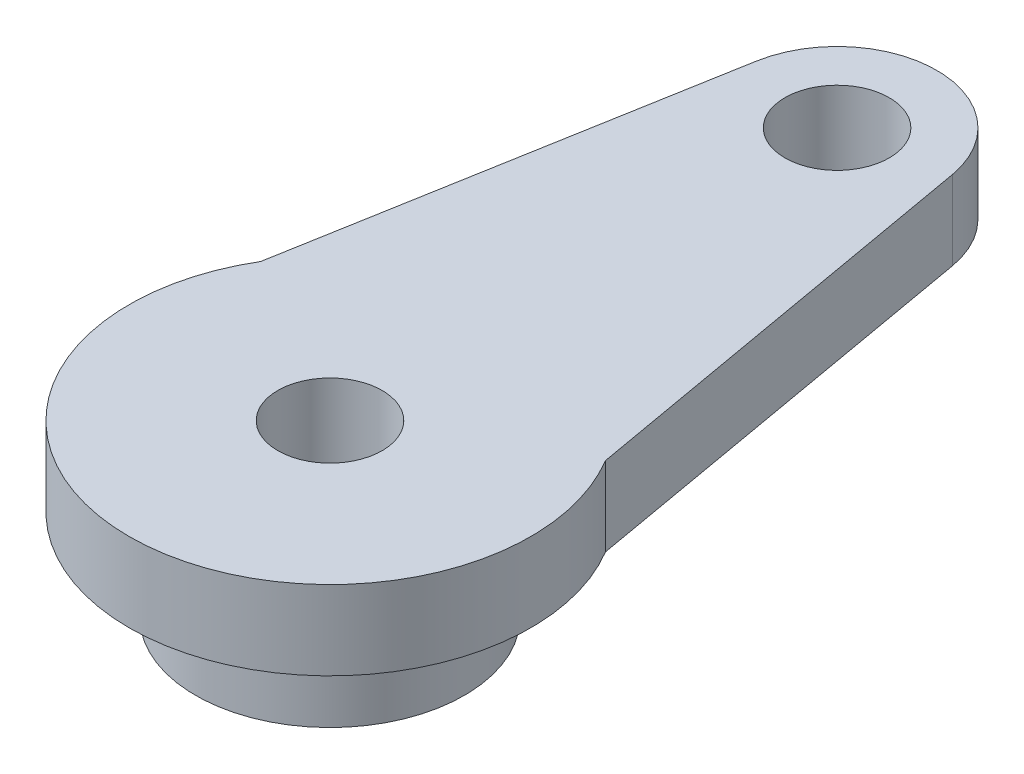
ISO-10303-21;
HEADER;
FILE_DESCRIPTION(('STEP AP214'),'2;1');
FILE_NAME('part.step','',(''),(''),'','','');
FILE_SCHEMA(('AUTOMOTIVE_DESIGN { 1 0 10303 214 1 1 1 1 }'));
ENDSEC;
DATA;
#1=APPLICATION_CONTEXT('core data for automotive mechanical design processes');
#2=APPLICATION_PROTOCOL_DEFINITION('international standard','automotive_design',2000,#1);
#3=PRODUCT_CONTEXT('',#1,'mechanical');
#4=PRODUCT('Part','Part','',(#3));
#5=PRODUCT_RELATED_PRODUCT_CATEGORY('part','',(#4));
#6=PRODUCT_DEFINITION_FORMATION('','',#4);
#7=PRODUCT_DEFINITION_CONTEXT('part definition',#1,'design');
#8=PRODUCT_DEFINITION('design','',#6,#7);
#9=PRODUCT_DEFINITION_SHAPE('','',#8);
#10=(LENGTH_UNIT() NAMED_UNIT(*) SI_UNIT(.MILLI.,.METRE.));
#11=(NAMED_UNIT(*) PLANE_ANGLE_UNIT() SI_UNIT($,.RADIAN.));
#12=(NAMED_UNIT(*) SI_UNIT($,.STERADIAN.) SOLID_ANGLE_UNIT());
#13=UNCERTAINTY_MEASURE_WITH_UNIT(LENGTH_MEASURE(1.E-05),#10,'distance_accuracy_value','');
#14=(GEOMETRIC_REPRESENTATION_CONTEXT(3) GLOBAL_UNCERTAINTY_ASSIGNED_CONTEXT((#13)) GLOBAL_UNIT_ASSIGNED_CONTEXT((#10,
#11,#12)) REPRESENTATION_CONTEXT('',''));
#15=CARTESIAN_POINT('',(0.,0.,0.));
#16=DIRECTION('',(0.,0.,1.));
#17=DIRECTION('',(1.,0.,0.));
#18=AXIS2_PLACEMENT_3D('',#15,#16,#17);
#19=CARTESIAN_POINT('',(0.,0.,0.));
#20=DIRECTION('',(0.,1.,0.));
#21=DIRECTION('',(0.,0.,1.));
#22=AXIS2_PLACEMENT_3D('',#19,#20,#21);
#23=PLANE('',#22);
#24=CARTESIAN_POINT('',(0.,0.,0.));
#25=DIRECTION('',(0.,-1.,0.));
#26=DIRECTION('',(0.,0.,-1.));
#27=AXIS2_PLACEMENT_3D('',#24,#25,#26);
#28=CIRCLE('',#27,3.025);
#29=CARTESIAN_POINT('',(0.,0.,-3.025));
#30=VERTEX_POINT('',#29);
#31=EDGE_CURVE('E174',#30,#30,#28,.T.);
#32=ORIENTED_EDGE('',*,*,#31,.F.);
#33=EDGE_LOOP('',(#32));
#34=FACE_BOUND('',#33,.T.);
#35=CARTESIAN_POINT('',(0.,0.,0.));
#36=DIRECTION('',(0.,-1.,0.));
#37=DIRECTION('',(0.,0.,-1.));
#38=AXIS2_PLACEMENT_3D('',#35,#36,#37);
#39=CIRCLE('',#38,4.25);
#40=CARTESIAN_POINT('',(0.,0.,-4.25));
#41=VERTEX_POINT('',#40);
#42=EDGE_CURVE('E101',#41,#41,#39,.T.);
#43=ORIENTED_EDGE('',*,*,#42,.T.);
#44=EDGE_LOOP('',(#43));
#45=FACE_BOUND('',#44,.T.);
#46=ADVANCED_FACE('F41',(#34,#45),#23,.F.);
#47=CARTESIAN_POINT('',(0.,5.4,0.));
#48=DIRECTION('',(0.,-1.,0.));
#49=DIRECTION('',(0.,0.,-1.));
#50=AXIS2_PLACEMENT_3D('',#47,#48,#49);
#51=CYLINDRICAL_SURFACE('',#50,6.35);
#52=DIRECTION('',(0.,1.,0.));
#53=VECTOR('',#52,1.);
#54=CARTESIAN_POINT('',(-5.45070200344737,2.9,-3.25765984559696));
#55=LINE('',#54,#53);
#56=CARTESIAN_POINT('',(-5.45070200344737,2.9,-3.25765984559696));
#57=VERTEX_POINT('',#56);
#58=CARTESIAN_POINT('',(-5.45070200344738,5.4,-3.25765984559695));
#59=VERTEX_POINT('',#58);
#60=EDGE_CURVE('E97',#57,#59,#55,.T.);
#61=ORIENTED_EDGE('',*,*,#60,.F.);
#62=CARTESIAN_POINT('',(0.,2.9,0.));
#63=DIRECTION('',(0.,1.,0.));
#64=DIRECTION('',(0.,0.,1.));
#65=AXIS2_PLACEMENT_3D('',#62,#63,#64);
#66=CIRCLE('',#65,6.35);
#67=CARTESIAN_POINT('',(5.45070200344738,2.9,-3.25765984559695));
#68=VERTEX_POINT('',#67);
#69=EDGE_CURVE('E93',#68,#57,#66,.F.);
#70=ORIENTED_EDGE('',*,*,#69,.F.);
#71=DIRECTION('',(0.,1.,0.));
#72=VECTOR('',#71,1.);
#73=CARTESIAN_POINT('',(5.45070200344737,2.9,-3.25765984559696));
#74=LINE('',#73,#72);
#75=CARTESIAN_POINT('',(5.45070200344737,5.4,-3.25765984559696));
#76=VERTEX_POINT('',#75);
#77=EDGE_CURVE('E96',#68,#76,#74,.T.);
#78=ORIENTED_EDGE('',*,*,#77,.T.);
#79=CARTESIAN_POINT('',(0.,5.4,0.));
#80=DIRECTION('',(0.,1.,0.));
#81=DIRECTION('',(0.,0.,1.));
#82=AXIS2_PLACEMENT_3D('',#79,#80,#81);
#83=CIRCLE('',#82,6.35);
#84=EDGE_CURVE('E11',#59,#76,#83,.T.);
#85=ORIENTED_EDGE('',*,*,#84,.F.);
#86=EDGE_LOOP('',(#61,#70,#78,#85));
#87=FACE_BOUND('',#86,.T.);
#88=ADVANCED_FACE('F43',(#87),#51,.T.);
#89=CARTESIAN_POINT('',(0.,5.4,0.));
#90=DIRECTION('',(0.,1.,0.));
#91=DIRECTION('',(0.,0.,1.));
#92=AXIS2_PLACEMENT_3D('',#89,#90,#91);
#93=PLANE('',#92);
#94=CARTESIAN_POINT('',(0.,5.4,-16.03));
#95=DIRECTION('',(0.,1.,0.));
#96=DIRECTION('',(0.,0.,1.));
#97=AXIS2_PLACEMENT_3D('',#94,#95,#96);
#98=CIRCLE('',#97,1.65);
#99=CARTESIAN_POINT('',(0.,5.4,-14.38));
#100=VERTEX_POINT('',#99);
#101=EDGE_CURVE('E137',#100,#100,#98,.T.);
#102=ORIENTED_EDGE('',*,*,#101,.F.);
#103=EDGE_LOOP('',(#102));
#104=FACE_BOUND('',#103,.T.);
#105=CARTESIAN_POINT('',(0.,5.4,0.));
#106=DIRECTION('',(0.,1.,0.));
#107=DIRECTION('',(0.,0.,1.));
#108=AXIS2_PLACEMENT_3D('',#105,#106,#107);
#109=CIRCLE('',#108,1.65);
#110=CARTESIAN_POINT('',(0.,5.4,1.65));
#111=VERTEX_POINT('',#110);
#112=EDGE_CURVE('E51',#111,#111,#109,.T.);
#113=ORIENTED_EDGE('',*,*,#112,.F.);
#114=EDGE_LOOP('',(#113));
#115=FACE_BOUND('',#114,.T.);
#116=ORIENTED_EDGE('',*,*,#84,.T.);
#117=DIRECTION('',(-0.173648177666923,0.,-0.984807753012209));
#118=VECTOR('',#117,1.);
#119=CARTESIAN_POINT('',(3.10214442198846,5.4,-16.5769917596508));
#120=LINE('',#119,#118);
#121=CARTESIAN_POINT('',(3.10214442198846,5.4,-16.5769917596508));
#122=VERTEX_POINT('',#121);
#123=EDGE_CURVE('E106',#76,#122,#120,.T.);
#124=ORIENTED_EDGE('',*,*,#123,.T.);
#125=CARTESIAN_POINT('',(0.,5.4,-16.03));
#126=DIRECTION('',(0.,1.,0.));
#127=DIRECTION('',(0.,0.,1.));
#128=AXIS2_PLACEMENT_3D('',#125,#126,#127);
#129=CIRCLE('',#128,3.15);
#130=CARTESIAN_POINT('',(-3.10214442198846,5.4,-16.5769917596508));
#131=VERTEX_POINT('',#130);
#132=EDGE_CURVE('E121',#122,#131,#129,.T.);
#133=ORIENTED_EDGE('',*,*,#132,.T.);
#134=DIRECTION('',(-0.173648177666923,0.,0.984807753012209));
#135=VECTOR('',#134,1.);
#136=CARTESIAN_POINT('',(-3.10214442198846,5.4,-16.5769917596508));
#137=LINE('',#136,#135);
#138=EDGE_CURVE('E58',#131,#59,#137,.T.);
#139=ORIENTED_EDGE('',*,*,#138,.T.);
#140=EDGE_LOOP('',(#116,#124,#133,#139));
#141=FACE_BOUND('',#140,.T.);
#142=ADVANCED_FACE('F152',(#104,#115,#141),#93,.T.);
#143=CARTESIAN_POINT('',(0.,0.,0.));
#144=DIRECTION('',(0.,1.,0.));
#145=DIRECTION('',(0.,0.,1.));
#146=AXIS2_PLACEMENT_3D('',#143,#144,#145);
#147=CYLINDRICAL_SURFACE('',#146,1.65);
#148=CARTESIAN_POINT('',(0.,2.9,0.));
#149=DIRECTION('',(0.,1.,0.));
#150=DIRECTION('',(0.,0.,1.));
#151=AXIS2_PLACEMENT_3D('',#148,#149,#150);
#152=CIRCLE('',#151,1.65);
#153=CARTESIAN_POINT('',(0.,2.9,1.65));
#154=VERTEX_POINT('',#153);
#155=EDGE_CURVE('E45',#154,#154,#152,.F.);
#156=CARTESIAN_POINT('',(0.,2.9,1.65));
#157=CARTESIAN_POINT('',(0.,2.92604166666667,1.65));
#158=CARTESIAN_POINT('',(0.,2.95208333333333,1.65));
#159=CARTESIAN_POINT('',(0.,3.00416666666667,1.65));
#160=CARTESIAN_POINT('',(0.,3.03020833333333,1.65));
#161=CARTESIAN_POINT('',(0.,3.08229166666667,1.65));
#162=CARTESIAN_POINT('',(0.,3.10833333333333,1.65));
#163=CARTESIAN_POINT('',(0.,3.16041666666667,1.65));
#164=CARTESIAN_POINT('',(0.,3.18645833333333,1.65));
#165=CARTESIAN_POINT('',(0.,3.23854166666667,1.65));
#166=CARTESIAN_POINT('',(0.,3.26458333333333,1.65));
#167=CARTESIAN_POINT('',(0.,3.31666666666667,1.65));
#168=CARTESIAN_POINT('',(0.,3.34270833333333,1.65));
#169=CARTESIAN_POINT('',(0.,3.39479166666667,1.65));
#170=CARTESIAN_POINT('',(0.,3.42083333333333,1.65));
#171=CARTESIAN_POINT('',(0.,3.47291666666667,1.65));
#172=CARTESIAN_POINT('',(0.,3.49895833333333,1.65));
#173=CARTESIAN_POINT('',(0.,3.55104166666667,1.65));
#174=CARTESIAN_POINT('',(0.,3.57708333333333,1.65));
#175=CARTESIAN_POINT('',(0.,3.62916666666667,1.65));
#176=CARTESIAN_POINT('',(0.,3.65520833333333,1.65));
#177=CARTESIAN_POINT('',(0.,3.70729166666667,1.65));
#178=CARTESIAN_POINT('',(0.,3.73333333333333,1.65));
#179=CARTESIAN_POINT('',(0.,3.78541666666667,1.65));
#180=CARTESIAN_POINT('',(0.,3.81145833333333,1.65));
#181=CARTESIAN_POINT('',(0.,3.86354166666667,1.65));
#182=CARTESIAN_POINT('',(0.,3.88958333333333,1.65));
#183=CARTESIAN_POINT('',(0.,3.94166666666667,1.65));
#184=CARTESIAN_POINT('',(0.,3.96770833333333,1.65));
#185=CARTESIAN_POINT('',(0.,4.01979166666667,1.65));
#186=CARTESIAN_POINT('',(0.,4.04583333333333,1.65));
#187=CARTESIAN_POINT('',(0.,4.09791666666667,1.65));
#188=CARTESIAN_POINT('',(0.,4.12395833333333,1.65));
#189=CARTESIAN_POINT('',(0.,4.17604166666667,1.65));
#190=CARTESIAN_POINT('',(0.,4.20208333333333,1.65));
#191=CARTESIAN_POINT('',(0.,4.25416666666667,1.65));
#192=CARTESIAN_POINT('',(0.,4.28020833333333,1.65));
#193=CARTESIAN_POINT('',(0.,4.33229166666667,1.65));
#194=CARTESIAN_POINT('',(0.,4.35833333333333,1.65));
#195=CARTESIAN_POINT('',(0.,4.41041666666667,1.65));
#196=CARTESIAN_POINT('',(0.,4.43645833333333,1.65));
#197=CARTESIAN_POINT('',(0.,4.48854166666667,1.65));
#198=CARTESIAN_POINT('',(0.,4.51458333333333,1.65));
#199=CARTESIAN_POINT('',(0.,4.56666666666667,1.65));
#200=CARTESIAN_POINT('',(0.,4.59270833333333,1.65));
#201=CARTESIAN_POINT('',(0.,4.64479166666667,1.65));
#202=CARTESIAN_POINT('',(0.,4.67083333333333,1.65));
#203=CARTESIAN_POINT('',(0.,4.72291666666667,1.65));
#204=CARTESIAN_POINT('',(0.,4.74895833333333,1.65));
#205=CARTESIAN_POINT('',(0.,4.80104166666667,1.65));
#206=CARTESIAN_POINT('',(0.,4.82708333333333,1.65));
#207=CARTESIAN_POINT('',(0.,4.87916666666667,1.65));
#208=CARTESIAN_POINT('',(0.,4.90520833333333,1.65));
#209=CARTESIAN_POINT('',(0.,4.95729166666667,1.65));
#210=CARTESIAN_POINT('',(0.,4.98333333333333,1.65));
#211=CARTESIAN_POINT('',(0.,5.03541666666667,1.65));
#212=CARTESIAN_POINT('',(0.,5.06145833333333,1.65));
#213=CARTESIAN_POINT('',(0.,5.11354166666667,1.65));
#214=CARTESIAN_POINT('',(0.,5.13958333333333,1.65));
#215=CARTESIAN_POINT('',(0.,5.19166666666667,1.65));
#216=CARTESIAN_POINT('',(0.,5.21770833333333,1.65));
#217=CARTESIAN_POINT('',(0.,5.26979166666667,1.65));
#218=CARTESIAN_POINT('',(0.,5.29583333333333,1.65));
#219=CARTESIAN_POINT('',(0.,5.34791666666667,1.65));
#220=CARTESIAN_POINT('',(0.,5.37395833333333,1.65));
#221=CARTESIAN_POINT('',(0.,5.4,1.65));
#222=B_SPLINE_CURVE_WITH_KNOTS('',3,(#156,#157,#158,#159,#160,#161,#162,#163,#164,#165,#166,
#167,#168,#169,#170,#171,#172,#173,#174,#175,#176,#177,#178,#179,#180,#181,#182,#183,#184,#185,
#186,#187,#188,#189,#190,#191,#192,#193,#194,#195,#196,#197,#198,#199,#200,#201,#202,#203,#204,
#205,#206,#207,#208,#209,#210,#211,#212,#213,#214,#215,#216,#217,#218,#219,#220,#221),
.UNSPECIFIED.,.F.,.F.,(4,2,2,2,2,2,2,2,2,2,2,2,2,2,2,2,2,2,2,2,2,2,2,2,2,2,2,2,2,2,2,2,4),(0.,
0.0781250000000001,0.15625,0.234375,0.3125,0.390625,0.46875,0.546875,0.625,0.703125,0.78125,
0.859375,0.9375,1.015625,1.09375,1.171875,1.25,1.328125,1.40625,1.484375,1.5625,1.640625,
1.71875,1.796875,1.875,1.953125,2.03125,2.109375,2.1875,2.265625,2.34375,2.421875,2.5),.UNSPECIFIED.);
#223=EDGE_CURVE('BSEAM154',#154,#111,#222,.T.);
#224=ORIENTED_EDGE('',*,*,#155,.T.);
#225=ORIENTED_EDGE('',*,*,#112,.T.);
#226=ORIENTED_EDGE('',*,*,#223,.T.);
#227=ORIENTED_EDGE('',*,*,#223,.F.);
#228=EDGE_LOOP('',(#224,#226,#225,#227));
#229=FACE_BOUND('',#228,.T.);
#230=ADVANCED_FACE('F154',(#229),#147,.F.);
#231=CARTESIAN_POINT('',(0.,2.9,-16.03));
#232=DIRECTION('',(0.,1.,0.));
#233=DIRECTION('',(0.,0.,1.));
#234=AXIS2_PLACEMENT_3D('',#231,#232,#233);
#235=CYLINDRICAL_SURFACE('',#234,3.15);
#236=ORIENTED_EDGE('',*,*,#132,.F.);
#237=DIRECTION('',(0.,1.,0.));
#238=VECTOR('',#237,1.);
#239=CARTESIAN_POINT('',(3.10214442198846,2.9,-16.5769917596508));
#240=LINE('',#239,#238);
#241=CARTESIAN_POINT('',(3.10214442198846,2.9,-16.5769917596508));
#242=VERTEX_POINT('',#241);
#243=EDGE_CURVE('E67',#242,#122,#240,.T.);
#244=ORIENTED_EDGE('',*,*,#243,.F.);
#245=CARTESIAN_POINT('',(0.,2.9,-16.03));
#246=DIRECTION('',(0.,1.,0.));
#247=DIRECTION('',(0.,0.,1.));
#248=AXIS2_PLACEMENT_3D('',#245,#246,#247);
#249=CIRCLE('',#248,3.15);
#250=CARTESIAN_POINT('',(-3.10214442198846,2.9,-16.5769917596508));
#251=VERTEX_POINT('',#250);
#252=EDGE_CURVE('E111',#242,#251,#249,.T.);
#253=ORIENTED_EDGE('',*,*,#252,.T.);
#254=DIRECTION('',(0.,1.,0.));
#255=VECTOR('',#254,1.);
#256=CARTESIAN_POINT('',(-3.10214442198846,2.9,-16.5769917596508));
#257=LINE('',#256,#255);
#258=EDGE_CURVE('E86',#251,#131,#257,.T.);
#259=ORIENTED_EDGE('',*,*,#258,.T.);
#260=EDGE_LOOP('',(#236,#244,#253,#259));
#261=FACE_BOUND('',#260,.T.);
#262=ADVANCED_FACE('F150',(#261),#235,.T.);
#263=CARTESIAN_POINT('',(3.10214442198846,2.9,-16.5769917596508));
#264=DIRECTION('',(0.984807753012209,0.,-0.173648177666923));
#265=DIRECTION('',(-0.173648177666923,0.,-0.984807753012209));
#266=AXIS2_PLACEMENT_3D('',#263,#264,#265);
#267=PLANE('',#266);
#268=ORIENTED_EDGE('',*,*,#123,.F.);
#269=ORIENTED_EDGE('',*,*,#77,.F.);
#270=DIRECTION('',(-0.173648177666923,0.,-0.984807753012209));
#271=VECTOR('',#270,1.);
#272=CARTESIAN_POINT('',(3.10214442198846,2.9,-16.5769917596508));
#273=LINE('',#272,#271);
#274=EDGE_CURVE('E104',#68,#242,#273,.T.);
#275=ORIENTED_EDGE('',*,*,#274,.T.);
#276=ORIENTED_EDGE('',*,*,#243,.T.);
#277=EDGE_LOOP('',(#268,#269,#275,#276));
#278=FACE_BOUND('',#277,.T.);
#279=ADVANCED_FACE('F103',(#278),#267,.T.);
#280=CARTESIAN_POINT('',(-3.10214442198846,2.9,-16.5769917596508));
#281=DIRECTION('',(-0.984807753012209,0.,-0.173648177666923));
#282=DIRECTION('',(-0.173648177666923,0.,0.984807753012209));
#283=AXIS2_PLACEMENT_3D('',#280,#281,#282);
#284=PLANE('',#283);
#285=ORIENTED_EDGE('',*,*,#138,.F.);
#286=ORIENTED_EDGE('',*,*,#258,.F.);
#287=DIRECTION('',(-0.173648177666923,0.,0.984807753012209));
#288=VECTOR('',#287,1.);
#289=CARTESIAN_POINT('',(-3.10214442198846,2.9,-16.5769917596508));
#290=LINE('',#289,#288);
#291=EDGE_CURVE('E113',#251,#57,#290,.T.);
#292=ORIENTED_EDGE('',*,*,#291,.T.);
#293=ORIENTED_EDGE('',*,*,#60,.T.);
#294=EDGE_LOOP('',(#285,#286,#292,#293));
#295=FACE_BOUND('',#294,.T.);
#296=ADVANCED_FACE('F151',(#295),#284,.T.);
#297=CARTESIAN_POINT('',(0.,2.9,-16.03));
#298=DIRECTION('',(0.,1.,0.));
#299=DIRECTION('',(0.,0.,1.));
#300=AXIS2_PLACEMENT_3D('',#297,#298,#299);
#301=PLANE('',#300);
#302=CARTESIAN_POINT('',(0.,2.9,-16.03));
#303=DIRECTION('',(0.,1.,0.));
#304=DIRECTION('',(0.,0.,1.));
#305=AXIS2_PLACEMENT_3D('',#302,#303,#304);
#306=CIRCLE('',#305,1.65);
#307=CARTESIAN_POINT('',(0.,2.9,-14.38));
#308=VERTEX_POINT('',#307);
#309=EDGE_CURVE('E124',#308,#308,#306,.T.);
#310=ORIENTED_EDGE('',*,*,#309,.T.);
#311=EDGE_LOOP('',(#310));
#312=FACE_BOUND('',#311,.T.);
#313=ORIENTED_EDGE('',*,*,#252,.F.);
#314=ORIENTED_EDGE('',*,*,#274,.F.);
#315=ORIENTED_EDGE('',*,*,#69,.T.);
#316=ORIENTED_EDGE('',*,*,#291,.F.);
#317=EDGE_LOOP('',(#313,#314,#315,#316));
#318=FACE_BOUND('',#317,.T.);
#319=CARTESIAN_POINT('',(0.,2.9,0.));
#320=DIRECTION('',(0.,1.,0.));
#321=DIRECTION('',(0.,0.,1.));
#322=AXIS2_PLACEMENT_3D('',#319,#320,#321);
#323=CIRCLE('',#322,4.25);
#324=CARTESIAN_POINT('',(0.,2.9,-4.25));
#325=VERTEX_POINT('',#324);
#326=EDGE_CURVE('E142',#325,#325,#323,.F.);
#327=ORIENTED_EDGE('',*,*,#326,.F.);
#328=EDGE_LOOP('',(#327));
#329=FACE_BOUND('',#328,.T.);
#330=ADVANCED_FACE('F109',(#312,#318,#329),#301,.F.);
#331=CARTESIAN_POINT('',(0.,0.,-16.03));
#332=DIRECTION('',(0.,1.,0.));
#333=DIRECTION('',(0.,0.,1.));
#334=AXIS2_PLACEMENT_3D('',#331,#332,#333);
#335=CYLINDRICAL_SURFACE('',#334,1.65);
#336=CARTESIAN_POINT('',(0.,5.4,-14.38));
#337=CARTESIAN_POINT('',(0.,5.37395833333333,-14.38));
#338=CARTESIAN_POINT('',(0.,5.34791666666667,-14.38));
#339=CARTESIAN_POINT('',(0.,5.29583333333333,-14.38));
#340=CARTESIAN_POINT('',(0.,5.26979166666667,-14.38));
#341=CARTESIAN_POINT('',(0.,5.21770833333333,-14.38));
#342=CARTESIAN_POINT('',(0.,5.19166666666667,-14.38));
#343=CARTESIAN_POINT('',(0.,5.13958333333333,-14.38));
#344=CARTESIAN_POINT('',(0.,5.11354166666667,-14.38));
#345=CARTESIAN_POINT('',(0.,5.06145833333333,-14.38));
#346=CARTESIAN_POINT('',(0.,5.03541666666667,-14.38));
#347=CARTESIAN_POINT('',(0.,4.98333333333333,-14.38));
#348=CARTESIAN_POINT('',(0.,4.95729166666667,-14.38));
#349=CARTESIAN_POINT('',(0.,4.90520833333333,-14.38));
#350=CARTESIAN_POINT('',(0.,4.87916666666667,-14.38));
#351=CARTESIAN_POINT('',(0.,4.82708333333333,-14.38));
#352=CARTESIAN_POINT('',(0.,4.80104166666667,-14.38));
#353=CARTESIAN_POINT('',(0.,4.74895833333333,-14.38));
#354=CARTESIAN_POINT('',(0.,4.72291666666667,-14.38));
#355=CARTESIAN_POINT('',(0.,4.67083333333333,-14.38));
#356=CARTESIAN_POINT('',(0.,4.64479166666667,-14.38));
#357=CARTESIAN_POINT('',(0.,4.59270833333333,-14.38));
#358=CARTESIAN_POINT('',(0.,4.56666666666667,-14.38));
#359=CARTESIAN_POINT('',(0.,4.51458333333333,-14.38));
#360=CARTESIAN_POINT('',(0.,4.48854166666667,-14.38));
#361=CARTESIAN_POINT('',(0.,4.43645833333333,-14.38));
#362=CARTESIAN_POINT('',(0.,4.41041666666667,-14.38));
#363=CARTESIAN_POINT('',(0.,4.35833333333333,-14.38));
#364=CARTESIAN_POINT('',(0.,4.33229166666667,-14.38));
#365=CARTESIAN_POINT('',(0.,4.28020833333333,-14.38));
#366=CARTESIAN_POINT('',(0.,4.25416666666667,-14.38));
#367=CARTESIAN_POINT('',(0.,4.20208333333333,-14.38));
#368=CARTESIAN_POINT('',(0.,4.17604166666667,-14.38));
#369=CARTESIAN_POINT('',(0.,4.12395833333333,-14.38));
#370=CARTESIAN_POINT('',(0.,4.09791666666667,-14.38));
#371=CARTESIAN_POINT('',(0.,4.04583333333333,-14.38));
#372=CARTESIAN_POINT('',(0.,4.01979166666667,-14.38));
#373=CARTESIAN_POINT('',(0.,3.96770833333333,-14.38));
#374=CARTESIAN_POINT('',(0.,3.94166666666667,-14.38));
#375=CARTESIAN_POINT('',(0.,3.88958333333333,-14.38));
#376=CARTESIAN_POINT('',(0.,3.86354166666667,-14.38));
#377=CARTESIAN_POINT('',(0.,3.81145833333333,-14.38));
#378=CARTESIAN_POINT('',(0.,3.78541666666667,-14.38));
#379=CARTESIAN_POINT('',(0.,3.73333333333333,-14.38));
#380=CARTESIAN_POINT('',(0.,3.70729166666667,-14.38));
#381=CARTESIAN_POINT('',(0.,3.65520833333333,-14.38));
#382=CARTESIAN_POINT('',(0.,3.62916666666667,-14.38));
#383=CARTESIAN_POINT('',(0.,3.57708333333333,-14.38));
#384=CARTESIAN_POINT('',(0.,3.55104166666667,-14.38));
#385=CARTESIAN_POINT('',(0.,3.49895833333333,-14.38));
#386=CARTESIAN_POINT('',(0.,3.47291666666667,-14.38));
#387=CARTESIAN_POINT('',(0.,3.42083333333333,-14.38));
#388=CARTESIAN_POINT('',(0.,3.39479166666667,-14.38));
#389=CARTESIAN_POINT('',(0.,3.34270833333333,-14.38));
#390=CARTESIAN_POINT('',(0.,3.31666666666667,-14.38));
#391=CARTESIAN_POINT('',(0.,3.26458333333333,-14.38));
#392=CARTESIAN_POINT('',(0.,3.23854166666667,-14.38));
#393=CARTESIAN_POINT('',(0.,3.18645833333333,-14.38));
#394=CARTESIAN_POINT('',(0.,3.16041666666667,-14.38));
#395=CARTESIAN_POINT('',(0.,3.10833333333333,-14.38));
#396=CARTESIAN_POINT('',(0.,3.08229166666667,-14.38));
#397=CARTESIAN_POINT('',(0.,3.03020833333333,-14.38));
#398=CARTESIAN_POINT('',(0.,3.00416666666667,-14.38));
#399=CARTESIAN_POINT('',(0.,2.95208333333333,-14.38));
#400=CARTESIAN_POINT('',(0.,2.92604166666667,-14.38));
#401=CARTESIAN_POINT('',(0.,2.9,-14.38));
#402=B_SPLINE_CURVE_WITH_KNOTS('',3,(#336,#337,#338,#339,#340,#341,#342,#343,#344,#345,#346,
#347,#348,#349,#350,#351,#352,#353,#354,#355,#356,#357,#358,#359,#360,#361,#362,#363,#364,#365,
#366,#367,#368,#369,#370,#371,#372,#373,#374,#375,#376,#377,#378,#379,#380,#381,#382,#383,#384,
#385,#386,#387,#388,#389,#390,#391,#392,#393,#394,#395,#396,#397,#398,#399,#400,#401),
.UNSPECIFIED.,.F.,.F.,(4,2,2,2,2,2,2,2,2,2,2,2,2,2,2,2,2,2,2,2,2,2,2,2,2,2,2,2,2,2,2,2,4),(0.,
0.0781250000000001,0.15625,0.234375,0.3125,0.390625,0.46875,0.546875,0.625,0.703125,0.78125,
0.859375,0.9375,1.015625,1.09375,1.171875,1.25,1.328125,1.40625,1.484375,1.5625,1.640625,
1.71875,1.796875,1.875,1.953125,2.03125,2.109375,2.1875,2.265625,2.34375,2.421875,2.5),.UNSPECIFIED.);
#403=EDGE_CURVE('BSEAM206',#100,#308,#402,.T.);
#404=ORIENTED_EDGE('',*,*,#101,.T.);
#405=ORIENTED_EDGE('',*,*,#309,.F.);
#406=ORIENTED_EDGE('',*,*,#403,.T.);
#407=ORIENTED_EDGE('',*,*,#403,.F.);
#408=EDGE_LOOP('',(#404,#406,#405,#407));
#409=FACE_BOUND('',#408,.T.);
#410=ADVANCED_FACE('F206',(#409),#335,.F.);
#411=CARTESIAN_POINT('',(0.,20.8605122421383,0.));
#412=DIRECTION('',(0.,-1.,0.));
#413=DIRECTION('',(0.,0.,-1.));
#414=AXIS2_PLACEMENT_3D('',#411,#412,#413);
#415=CYLINDRICAL_SURFACE('',#414,4.25);
#416=CARTESIAN_POINT('',(0.,0.,-4.25));
#417=CARTESIAN_POINT('',(0.,0.0302083333333369,-4.25));
#418=CARTESIAN_POINT('',(0.,0.0604166666666704,-4.25));
#419=CARTESIAN_POINT('',(0.,0.120833333333337,-4.25));
#420=CARTESIAN_POINT('',(0.,0.151041666666671,-4.25));
#421=CARTESIAN_POINT('',(0.,0.211458333333337,-4.25));
#422=CARTESIAN_POINT('',(0.,0.241666666666669,-4.25));
#423=CARTESIAN_POINT('',(0.,0.302083333333335,-4.25));
#424=CARTESIAN_POINT('',(0.,0.332291666666668,-4.25));
#425=CARTESIAN_POINT('',(0.,0.392708333333335,-4.25));
#426=CARTESIAN_POINT('',(0.,0.422916666666669,-4.25));
#427=CARTESIAN_POINT('',(0.,0.483333333333336,-4.25));
#428=CARTESIAN_POINT('',(0.,0.513541666666669,-4.25));
#429=CARTESIAN_POINT('',(0.,0.573958333333336,-4.25));
#430=CARTESIAN_POINT('',(0.,0.60416666666667,-4.25));
#431=CARTESIAN_POINT('',(0.,0.664583333333335,-4.25));
#432=CARTESIAN_POINT('',(0.,0.694791666666668,-4.25));
#433=CARTESIAN_POINT('',(0.,0.755208333333333,-4.25));
#434=CARTESIAN_POINT('',(0.,0.785416666666667,-4.25));
#435=CARTESIAN_POINT('',(0.,0.845833333333334,-4.25));
#436=CARTESIAN_POINT('',(0.,0.876041666666667,-4.25));
#437=CARTESIAN_POINT('',(0.,0.936458333333334,-4.25));
#438=CARTESIAN_POINT('',(0.,0.966666666666668,-4.25));
#439=CARTESIAN_POINT('',(0.,1.02708333333333,-4.25));
#440=CARTESIAN_POINT('',(0.,1.05729166666667,-4.25));
#441=CARTESIAN_POINT('',(0.,1.11770833333334,-4.25));
#442=CARTESIAN_POINT('',(0.,1.14791666666667,-4.25));
#443=CARTESIAN_POINT('',(0.,1.20833333333333,-4.25));
#444=CARTESIAN_POINT('',(0.,1.23854166666667,-4.25));
#445=CARTESIAN_POINT('',(0.,1.29895833333333,-4.25));
#446=CARTESIAN_POINT('',(0.,1.32916666666667,-4.25));
#447=CARTESIAN_POINT('',(0.,1.38958333333333,-4.25));
#448=CARTESIAN_POINT('',(0.,1.41979166666667,-4.25));
#449=CARTESIAN_POINT('',(0.,1.48020833333333,-4.25));
#450=CARTESIAN_POINT('',(0.,1.51041666666667,-4.25));
#451=CARTESIAN_POINT('',(0.,1.57083333333333,-4.25));
#452=CARTESIAN_POINT('',(0.,1.60104166666667,-4.25));
#453=CARTESIAN_POINT('',(0.,1.66145833333333,-4.25));
#454=CARTESIAN_POINT('',(0.,1.69166666666667,-4.25));
#455=CARTESIAN_POINT('',(0.,1.75208333333333,-4.25));
#456=CARTESIAN_POINT('',(0.,1.78229166666666,-4.25));
#457=CARTESIAN_POINT('',(0.,1.84270833333333,-4.25));
#458=CARTESIAN_POINT('',(0.,1.87291666666667,-4.25));
#459=CARTESIAN_POINT('',(0.,1.93333333333333,-4.25));
#460=CARTESIAN_POINT('',(0.,1.96354166666667,-4.25));
#461=CARTESIAN_POINT('',(0.,2.02395833333333,-4.25));
#462=CARTESIAN_POINT('',(0.,2.05416666666667,-4.25));
#463=CARTESIAN_POINT('',(0.,2.11458333333333,-4.25));
#464=CARTESIAN_POINT('',(0.,2.14479166666667,-4.25));
#465=CARTESIAN_POINT('',(0.,2.20520833333333,-4.25));
#466=CARTESIAN_POINT('',(0.,2.23541666666666,-4.25));
#467=CARTESIAN_POINT('',(0.,2.29583333333333,-4.25));
#468=CARTESIAN_POINT('',(0.,2.32604166666666,-4.25));
#469=CARTESIAN_POINT('',(0.,2.38645833333333,-4.25));
#470=CARTESIAN_POINT('',(0.,2.41666666666666,-4.25));
#471=CARTESIAN_POINT('',(0.,2.47708333333333,-4.25));
#472=CARTESIAN_POINT('',(0.,2.50729166666666,-4.25));
#473=CARTESIAN_POINT('',(0.,2.56770833333333,-4.25));
#474=CARTESIAN_POINT('',(0.,2.59791666666667,-4.25));
#475=CARTESIAN_POINT('',(0.,2.65833333333333,-4.25));
#476=CARTESIAN_POINT('',(0.,2.68854166666666,-4.25));
#477=CARTESIAN_POINT('',(0.,2.74895833333333,-4.25));
#478=CARTESIAN_POINT('',(0.,2.77916666666666,-4.25));
#479=CARTESIAN_POINT('',(0.,2.83958333333333,-4.25));
#480=CARTESIAN_POINT('',(0.,2.86979166666666,-4.25));
#481=CARTESIAN_POINT('',(0.,2.9,-4.25));
#482=B_SPLINE_CURVE_WITH_KNOTS('',3,(#416,#417,#418,#419,#420,#421,#422,#423,#424,#425,#426,
#427,#428,#429,#430,#431,#432,#433,#434,#435,#436,#437,#438,#439,#440,#441,#442,#443,#444,#445,
#446,#447,#448,#449,#450,#451,#452,#453,#454,#455,#456,#457,#458,#459,#460,#461,#462,#463,#464,
#465,#466,#467,#468,#469,#470,#471,#472,#473,#474,#475,#476,#477,#478,#479,#480,#481),
.UNSPECIFIED.,.F.,.F.,(4,2,2,2,2,2,2,2,2,2,2,2,2,2,2,2,2,2,2,2,2,2,2,2,2,2,2,2,2,2,2,2,4),(0.,
0.0906250000000004,0.181250000000001,0.271874999999998,0.362499999999998,0.453124999999999,
0.543749999999999,0.634374999999999,0.724999999999997,0.815624999999997,0.906249999999997,
0.996874999999998,1.0875,1.178125,1.26875,1.359375,1.45,1.540625,1.63125,1.72187499999999,
1.81249999999999,1.903125,1.99375,2.084375,2.175,2.26562499999999,2.35624999999999,
2.44687499999999,2.53749999999999,2.62812499999999,2.71874999999999,2.80937499999999,
2.89999999999999),.UNSPECIFIED.);
#483=EDGE_CURVE('BSEAM196',#41,#325,#482,.T.);
#484=ORIENTED_EDGE('',*,*,#42,.F.);
#485=ORIENTED_EDGE('',*,*,#326,.T.);
#486=ORIENTED_EDGE('',*,*,#483,.T.);
#487=ORIENTED_EDGE('',*,*,#483,.F.);
#488=EDGE_LOOP('',(#484,#486,#485,#487));
#489=FACE_BOUND('',#488,.T.);
#490=ADVANCED_FACE('F196',(#489),#415,.T.);
#491=CARTESIAN_POINT('',(0.,2.9,-16.03));
#492=DIRECTION('',(0.,1.,0.));
#493=DIRECTION('',(0.,0.,1.));
#494=AXIS2_PLACEMENT_3D('',#491,#492,#493);
#495=PLANE('',#494);
#496=CARTESIAN_POINT('',(0.,2.9,0.));
#497=DIRECTION('',(0.,1.,0.));
#498=DIRECTION('',(0.,0.,1.));
#499=AXIS2_PLACEMENT_3D('',#496,#497,#498);
#500=CIRCLE('',#499,3.025);
#501=CARTESIAN_POINT('',(0.,2.9,3.025));
#502=VERTEX_POINT('',#501);
#503=EDGE_CURVE('E181',#502,#502,#500,.F.);
#504=ORIENTED_EDGE('',*,*,#503,.T.);
#505=EDGE_LOOP('',(#504));
#506=FACE_BOUND('',#505,.T.);
#507=ORIENTED_EDGE('',*,*,#155,.F.);
#508=EDGE_LOOP('',(#507));
#509=FACE_BOUND('',#508,.T.);
#510=ADVANCED_FACE('F190',(#506,#509),#495,.F.);
#511=CARTESIAN_POINT('',(0.,11.4559920523572,0.));
#512=DIRECTION('',(0.,-1.,0.));
#513=DIRECTION('',(0.,0.,-1.));
#514=AXIS2_PLACEMENT_3D('',#511,#512,#513);
#515=CYLINDRICAL_SURFACE('',#514,3.025);
#516=ORIENTED_EDGE('',*,*,#31,.T.);
#517=EDGE_LOOP('',(#516));
#518=FACE_BOUND('',#517,.T.);
#519=ORIENTED_EDGE('',*,*,#503,.F.);
#520=EDGE_LOOP('',(#519));
#521=FACE_BOUND('',#520,.T.);
#522=ADVANCED_FACE('F187',(#518,#521),#515,.F.);
#523=CLOSED_SHELL('',(#46,#88,#142,#230,#262,#279,#296,#330,#410,#490,#510,#522));
#524=MANIFOLD_SOLID_BREP('B2',#523);
#525=ADVANCED_BREP_SHAPE_REPRESENTATION('',(#18,#524),#14);
#526=SHAPE_DEFINITION_REPRESENTATION(#9,#525);
ENDSEC;
END-ISO-10303-21;
